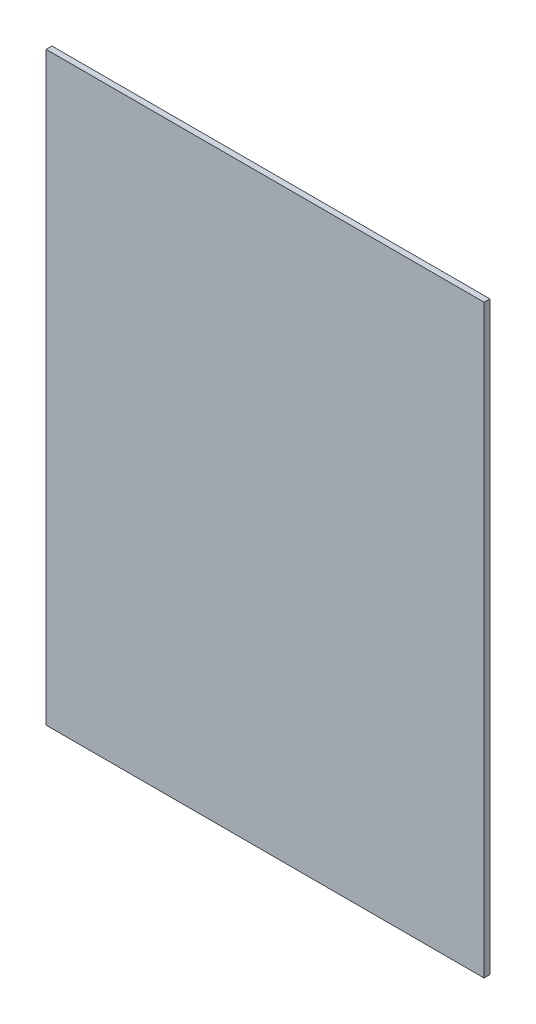
ISO-10303-21;
HEADER;
FILE_DESCRIPTION(('STEP AP214'),'2;1');
FILE_NAME('part.step','',(''),(''),'','','');
FILE_SCHEMA(('AUTOMOTIVE_DESIGN { 1 0 10303 214 1 1 1 1 }'));
ENDSEC;
DATA;
#1=APPLICATION_CONTEXT('core data for automotive mechanical design processes');
#2=APPLICATION_PROTOCOL_DEFINITION('international standard','automotive_design',2000,#1);
#3=PRODUCT_CONTEXT('',#1,'mechanical');
#4=PRODUCT('Part','Part','',(#3));
#5=PRODUCT_RELATED_PRODUCT_CATEGORY('part','',(#4));
#6=PRODUCT_DEFINITION_FORMATION('','',#4);
#7=PRODUCT_DEFINITION_CONTEXT('part definition',#1,'design');
#8=PRODUCT_DEFINITION('design','',#6,#7);
#9=PRODUCT_DEFINITION_SHAPE('','',#8);
#10=(LENGTH_UNIT() NAMED_UNIT(*) SI_UNIT(.MILLI.,.METRE.));
#11=(NAMED_UNIT(*) PLANE_ANGLE_UNIT() SI_UNIT($,.RADIAN.));
#12=(NAMED_UNIT(*) SI_UNIT($,.STERADIAN.) SOLID_ANGLE_UNIT());
#13=UNCERTAINTY_MEASURE_WITH_UNIT(LENGTH_MEASURE(1.E-05),#10,'distance_accuracy_value','');
#14=(GEOMETRIC_REPRESENTATION_CONTEXT(3) GLOBAL_UNCERTAINTY_ASSIGNED_CONTEXT((#13)) GLOBAL_UNIT_ASSIGNED_CONTEXT((#10,
#11,#12)) REPRESENTATION_CONTEXT('',''));
#15=CARTESIAN_POINT('',(0.,0.,0.));
#16=DIRECTION('',(0.,0.,1.));
#17=DIRECTION('',(1.,0.,0.));
#18=AXIS2_PLACEMENT_3D('',#15,#16,#17);
#19=CARTESIAN_POINT('',(75.05,100.3,2.));
#20=DIRECTION('',(-1.,0.,0.));
#21=DIRECTION('',(0.,-1.,0.));
#22=AXIS2_PLACEMENT_3D('',#19,#20,#21);
#23=PLANE('',#22);
#24=DIRECTION('',(0.,1.,0.));
#25=VECTOR('',#24,1.);
#26=CARTESIAN_POINT('',(75.05,100.3,0.));
#27=LINE('',#26,#25);
#28=CARTESIAN_POINT('',(75.05,-100.3,0.));
#29=VERTEX_POINT('',#28);
#30=CARTESIAN_POINT('',(75.05,100.3,0.));
#31=VERTEX_POINT('',#30);
#32=EDGE_CURVE('E97',#29,#31,#27,.T.);
#33=ORIENTED_EDGE('',*,*,#32,.T.);
#34=DIRECTION('',(0.,0.,-1.));
#35=VECTOR('',#34,1.);
#36=CARTESIAN_POINT('',(75.05,100.3,2.));
#37=LINE('',#36,#35);
#38=CARTESIAN_POINT('',(75.05,100.3,2.));
#39=VERTEX_POINT('',#38);
#40=EDGE_CURVE('E11',#39,#31,#37,.T.);
#41=ORIENTED_EDGE('',*,*,#40,.F.);
#42=DIRECTION('',(0.,1.,0.));
#43=VECTOR('',#42,1.);
#44=CARTESIAN_POINT('',(75.05,100.3,2.));
#45=LINE('',#44,#43);
#46=CARTESIAN_POINT('',(75.05,-100.3,2.));
#47=VERTEX_POINT('',#46);
#48=EDGE_CURVE('E85',#47,#39,#45,.T.);
#49=ORIENTED_EDGE('',*,*,#48,.F.);
#50=DIRECTION('',(0.,0.,-1.));
#51=VECTOR('',#50,1.);
#52=CARTESIAN_POINT('',(75.05,-100.3,2.));
#53=LINE('',#52,#51);
#54=EDGE_CURVE('E93',#47,#29,#53,.T.);
#55=ORIENTED_EDGE('',*,*,#54,.T.);
#56=EDGE_LOOP('',(#33,#41,#49,#55));
#57=FACE_BOUND('',#56,.T.);
#58=ADVANCED_FACE('F34',(#57),#23,.F.);
#59=CARTESIAN_POINT('',(-75.05,100.3,2.));
#60=DIRECTION('',(0.,-1.,0.));
#61=DIRECTION('',(0.,0.,-1.));
#62=AXIS2_PLACEMENT_3D('',#59,#60,#61);
#63=PLANE('',#62);
#64=DIRECTION('',(-1.,0.,0.));
#65=VECTOR('',#64,1.);
#66=CARTESIAN_POINT('',(-75.05,100.3,0.));
#67=LINE('',#66,#65);
#68=CARTESIAN_POINT('',(-75.05,100.3,0.));
#69=VERTEX_POINT('',#68);
#70=EDGE_CURVE('E89',#31,#69,#67,.T.);
#71=ORIENTED_EDGE('',*,*,#70,.T.);
#72=DIRECTION('',(0.,0.,-1.));
#73=VECTOR('',#72,1.);
#74=CARTESIAN_POINT('',(-75.05,100.3,2.));
#75=LINE('',#74,#73);
#76=CARTESIAN_POINT('',(-75.05,100.3,2.));
#77=VERTEX_POINT('',#76);
#78=EDGE_CURVE('E42',#77,#69,#75,.T.);
#79=ORIENTED_EDGE('',*,*,#78,.F.);
#80=DIRECTION('',(-1.,0.,0.));
#81=VECTOR('',#80,1.);
#82=CARTESIAN_POINT('',(-75.05,100.3,2.));
#83=LINE('',#82,#81);
#84=EDGE_CURVE('E80',#39,#77,#83,.T.);
#85=ORIENTED_EDGE('',*,*,#84,.F.);
#86=ORIENTED_EDGE('',*,*,#40,.T.);
#87=EDGE_LOOP('',(#71,#79,#85,#86));
#88=FACE_BOUND('',#87,.T.);
#89=ADVANCED_FACE('F88',(#88),#63,.F.);
#90=CARTESIAN_POINT('',(-75.05,100.3,2.));
#91=DIRECTION('',(1.,0.,0.));
#92=DIRECTION('',(0.,1.,0.));
#93=AXIS2_PLACEMENT_3D('',#90,#91,#92);
#94=PLANE('',#93);
#95=DIRECTION('',(0.,-1.,0.));
#96=VECTOR('',#95,1.);
#97=CARTESIAN_POINT('',(-75.05,100.3,0.));
#98=LINE('',#97,#96);
#99=CARTESIAN_POINT('',(-75.05,-100.3,0.));
#100=VERTEX_POINT('',#99);
#101=EDGE_CURVE('E67',#69,#100,#98,.T.);
#102=ORIENTED_EDGE('',*,*,#101,.T.);
#103=DIRECTION('',(0.,0.,-1.));
#104=VECTOR('',#103,1.);
#105=CARTESIAN_POINT('',(-75.05,-100.3,2.));
#106=LINE('',#105,#104);
#107=CARTESIAN_POINT('',(-75.05,-100.3,2.));
#108=VERTEX_POINT('',#107);
#109=EDGE_CURVE('E90',#108,#100,#106,.T.);
#110=ORIENTED_EDGE('',*,*,#109,.F.);
#111=DIRECTION('',(0.,-1.,0.));
#112=VECTOR('',#111,1.);
#113=CARTESIAN_POINT('',(-75.05,100.3,2.));
#114=LINE('',#113,#112);
#115=EDGE_CURVE('E83',#77,#108,#114,.T.);
#116=ORIENTED_EDGE('',*,*,#115,.F.);
#117=ORIENTED_EDGE('',*,*,#78,.T.);
#118=EDGE_LOOP('',(#102,#110,#116,#117));
#119=FACE_BOUND('',#118,.T.);
#120=ADVANCED_FACE('F91',(#119),#94,.F.);
#121=CARTESIAN_POINT('',(-75.05,-100.3,2.));
#122=DIRECTION('',(0.,1.,0.));
#123=DIRECTION('',(0.,0.,1.));
#124=AXIS2_PLACEMENT_3D('',#121,#122,#123);
#125=PLANE('',#124);
#126=DIRECTION('',(1.,0.,0.));
#127=VECTOR('',#126,1.);
#128=CARTESIAN_POINT('',(-75.05,-100.3,0.));
#129=LINE('',#128,#127);
#130=EDGE_CURVE('E73',#100,#29,#129,.T.);
#131=ORIENTED_EDGE('',*,*,#130,.T.);
#132=ORIENTED_EDGE('',*,*,#54,.F.);
#133=DIRECTION('',(1.,0.,0.));
#134=VECTOR('',#133,1.);
#135=CARTESIAN_POINT('',(-75.05,-100.3,2.));
#136=LINE('',#135,#134);
#137=EDGE_CURVE('E50',#108,#47,#136,.T.);
#138=ORIENTED_EDGE('',*,*,#137,.F.);
#139=ORIENTED_EDGE('',*,*,#109,.T.);
#140=EDGE_LOOP('',(#131,#132,#138,#139));
#141=FACE_BOUND('',#140,.T.);
#142=ADVANCED_FACE('F104',(#141),#125,.F.);
#143=CARTESIAN_POINT('',(0.,0.,2.));
#144=DIRECTION('',(0.,0.,1.));
#145=DIRECTION('',(1.,0.,0.));
#146=AXIS2_PLACEMENT_3D('',#143,#144,#145);
#147=PLANE('',#146);
#148=ORIENTED_EDGE('',*,*,#48,.T.);
#149=ORIENTED_EDGE('',*,*,#84,.T.);
#150=ORIENTED_EDGE('',*,*,#115,.T.);
#151=ORIENTED_EDGE('',*,*,#137,.T.);
#152=EDGE_LOOP('',(#148,#149,#150,#151));
#153=FACE_BOUND('',#152,.T.);
#154=ADVANCED_FACE('F81',(#153),#147,.T.);
#155=CARTESIAN_POINT('',(0.,0.,0.));
#156=DIRECTION('',(0.,0.,1.));
#157=DIRECTION('',(1.,0.,0.));
#158=AXIS2_PLACEMENT_3D('',#155,#156,#157);
#159=PLANE('',#158);
#160=ORIENTED_EDGE('',*,*,#32,.F.);
#161=ORIENTED_EDGE('',*,*,#130,.F.);
#162=ORIENTED_EDGE('',*,*,#101,.F.);
#163=ORIENTED_EDGE('',*,*,#70,.F.);
#164=EDGE_LOOP('',(#160,#161,#162,#163));
#165=FACE_BOUND('',#164,.T.);
#166=ADVANCED_FACE('F107',(#165),#159,.F.);
#167=CLOSED_SHELL('',(#58,#89,#120,#142,#154,#166));
#168=MANIFOLD_SOLID_BREP('B2',#167);
#169=ADVANCED_BREP_SHAPE_REPRESENTATION('',(#18,#168),#14);
#170=SHAPE_DEFINITION_REPRESENTATION(#9,#169);
ENDSEC;
END-ISO-10303-21;
